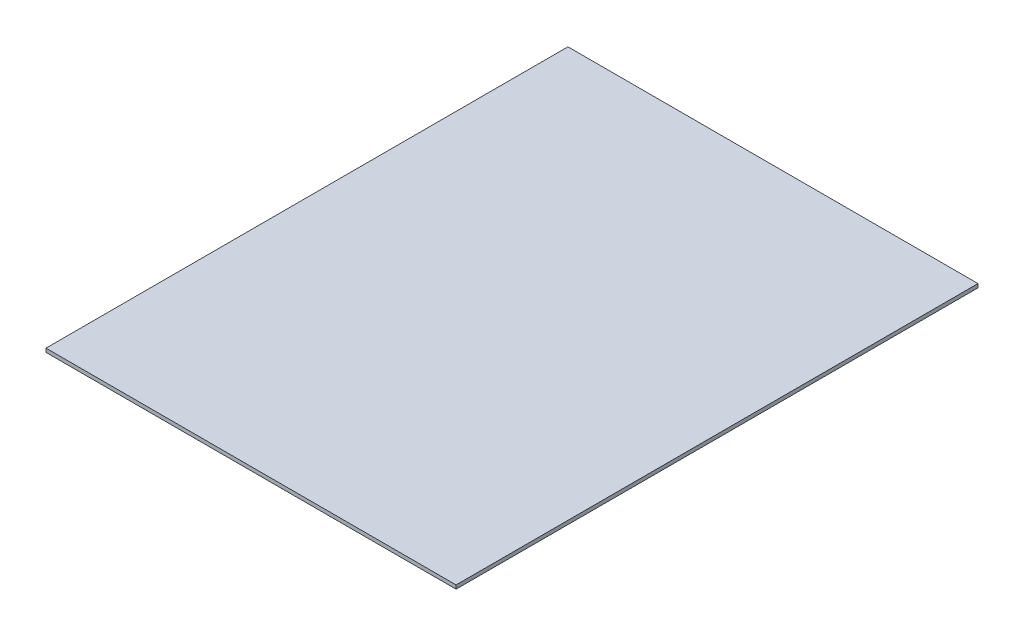
ISO-10303-21;
HEADER;
FILE_DESCRIPTION(('STEP AP214'),'2;1');
FILE_NAME('part.step','',(''),(''),'','','');
FILE_SCHEMA(('AUTOMOTIVE_DESIGN { 1 0 10303 214 1 1 1 1 }'));
ENDSEC;
DATA;
#1=APPLICATION_CONTEXT('core data for automotive mechanical design processes');
#2=APPLICATION_PROTOCOL_DEFINITION('international standard','automotive_design',2000,#1);
#3=PRODUCT_CONTEXT('',#1,'mechanical');
#4=PRODUCT('Part','Part','',(#3));
#5=PRODUCT_RELATED_PRODUCT_CATEGORY('part','',(#4));
#6=PRODUCT_DEFINITION_FORMATION('','',#4);
#7=PRODUCT_DEFINITION_CONTEXT('part definition',#1,'design');
#8=PRODUCT_DEFINITION('design','',#6,#7);
#9=PRODUCT_DEFINITION_SHAPE('','',#8);
#10=(LENGTH_UNIT() NAMED_UNIT(*) SI_UNIT(.MILLI.,.METRE.));
#11=(NAMED_UNIT(*) PLANE_ANGLE_UNIT() SI_UNIT($,.RADIAN.));
#12=(NAMED_UNIT(*) SI_UNIT($,.STERADIAN.) SOLID_ANGLE_UNIT());
#13=UNCERTAINTY_MEASURE_WITH_UNIT(LENGTH_MEASURE(1.E-05),#10,'distance_accuracy_value','');
#14=(GEOMETRIC_REPRESENTATION_CONTEXT(3) GLOBAL_UNCERTAINTY_ASSIGNED_CONTEXT((#13)) GLOBAL_UNIT_ASSIGNED_CONTEXT((#10,
#11,#12)) REPRESENTATION_CONTEXT('',''));
#15=CARTESIAN_POINT('',(0.,0.,0.));
#16=DIRECTION('',(0.,0.,1.));
#17=DIRECTION('',(1.,0.,0.));
#18=AXIS2_PLACEMENT_3D('',#15,#16,#17);
#19=CARTESIAN_POINT('',(0.,5.,0.));
#20=DIRECTION('',(-1.,0.,0.));
#21=DIRECTION('',(0.,0.,1.));
#22=AXIS2_PLACEMENT_3D('',#19,#20,#21);
#23=PLANE('',#22);
#24=DIRECTION('',(0.,0.,-1.));
#25=VECTOR('',#24,1.);
#26=CARTESIAN_POINT('',(0.,0.,0.));
#27=LINE('',#26,#25);
#28=CARTESIAN_POINT('',(0.,0.,700.));
#29=VERTEX_POINT('',#28);
#30=CARTESIAN_POINT('',(0.,0.,0.));
#31=VERTEX_POINT('',#30);
#32=EDGE_CURVE('E98',#29,#31,#27,.T.);
#33=ORIENTED_EDGE('',*,*,#32,.T.);
#34=DIRECTION('',(0.,-1.,0.));
#35=VECTOR('',#34,1.);
#36=CARTESIAN_POINT('',(0.,5.,0.));
#37=LINE('',#36,#35);
#38=CARTESIAN_POINT('',(0.,5.,0.));
#39=VERTEX_POINT('',#38);
#40=EDGE_CURVE('E11',#39,#31,#37,.T.);
#41=ORIENTED_EDGE('',*,*,#40,.F.);
#42=DIRECTION('',(0.,0.,-1.));
#43=VECTOR('',#42,1.);
#44=CARTESIAN_POINT('',(0.,5.,0.));
#45=LINE('',#44,#43);
#46=CARTESIAN_POINT('',(0.,5.,700.));
#47=VERTEX_POINT('',#46);
#48=EDGE_CURVE('E86',#47,#39,#45,.T.);
#49=ORIENTED_EDGE('',*,*,#48,.F.);
#50=DIRECTION('',(0.,-1.,0.));
#51=VECTOR('',#50,1.);
#52=CARTESIAN_POINT('',(0.,5.,700.));
#53=LINE('',#52,#51);
#54=EDGE_CURVE('E94',#47,#29,#53,.T.);
#55=ORIENTED_EDGE('',*,*,#54,.T.);
#56=EDGE_LOOP('',(#33,#41,#49,#55));
#57=FACE_BOUND('',#56,.T.);
#58=ADVANCED_FACE('F35',(#57),#23,.F.);
#59=CARTESIAN_POINT('',(0.,5.,0.));
#60=DIRECTION('',(0.,0.,1.));
#61=DIRECTION('',(1.,0.,0.));
#62=AXIS2_PLACEMENT_3D('',#59,#60,#61);
#63=PLANE('',#62);
#64=DIRECTION('',(-1.,0.,0.));
#65=VECTOR('',#64,1.);
#66=CARTESIAN_POINT('',(0.,0.,0.));
#67=LINE('',#66,#65);
#68=CARTESIAN_POINT('',(-550.,0.,0.));
#69=VERTEX_POINT('',#68);
#70=EDGE_CURVE('E90',#31,#69,#67,.T.);
#71=ORIENTED_EDGE('',*,*,#70,.T.);
#72=DIRECTION('',(0.,-1.,0.));
#73=VECTOR('',#72,1.);
#74=CARTESIAN_POINT('',(-550.,5.,0.));
#75=LINE('',#74,#73);
#76=CARTESIAN_POINT('',(-550.,5.,0.));
#77=VERTEX_POINT('',#76);
#78=EDGE_CURVE('E43',#77,#69,#75,.T.);
#79=ORIENTED_EDGE('',*,*,#78,.F.);
#80=DIRECTION('',(-1.,0.,0.));
#81=VECTOR('',#80,1.);
#82=CARTESIAN_POINT('',(0.,5.,0.));
#83=LINE('',#82,#81);
#84=EDGE_CURVE('E81',#39,#77,#83,.T.);
#85=ORIENTED_EDGE('',*,*,#84,.F.);
#86=ORIENTED_EDGE('',*,*,#40,.T.);
#87=EDGE_LOOP('',(#71,#79,#85,#86));
#88=FACE_BOUND('',#87,.T.);
#89=ADVANCED_FACE('F89',(#88),#63,.F.);
#90=CARTESIAN_POINT('',(-550.,5.,0.));
#91=DIRECTION('',(1.,0.,0.));
#92=DIRECTION('',(0.,0.,-1.));
#93=AXIS2_PLACEMENT_3D('',#90,#91,#92);
#94=PLANE('',#93);
#95=DIRECTION('',(0.,0.,1.));
#96=VECTOR('',#95,1.);
#97=CARTESIAN_POINT('',(-550.,0.,0.));
#98=LINE('',#97,#96);
#99=CARTESIAN_POINT('',(-550.,0.,700.));
#100=VERTEX_POINT('',#99);
#101=EDGE_CURVE('E68',#69,#100,#98,.T.);
#102=ORIENTED_EDGE('',*,*,#101,.T.);
#103=DIRECTION('',(0.,-1.,0.));
#104=VECTOR('',#103,1.);
#105=CARTESIAN_POINT('',(-550.,5.,700.));
#106=LINE('',#105,#104);
#107=CARTESIAN_POINT('',(-550.,5.,700.));
#108=VERTEX_POINT('',#107);
#109=EDGE_CURVE('E91',#108,#100,#106,.T.);
#110=ORIENTED_EDGE('',*,*,#109,.F.);
#111=DIRECTION('',(0.,0.,1.));
#112=VECTOR('',#111,1.);
#113=CARTESIAN_POINT('',(-550.,5.,0.));
#114=LINE('',#113,#112);
#115=EDGE_CURVE('E84',#77,#108,#114,.T.);
#116=ORIENTED_EDGE('',*,*,#115,.F.);
#117=ORIENTED_EDGE('',*,*,#78,.T.);
#118=EDGE_LOOP('',(#102,#110,#116,#117));
#119=FACE_BOUND('',#118,.T.);
#120=ADVANCED_FACE('F92',(#119),#94,.F.);
#121=CARTESIAN_POINT('',(0.,5.,700.));
#122=DIRECTION('',(0.,0.,-1.));
#123=DIRECTION('',(-1.,0.,0.));
#124=AXIS2_PLACEMENT_3D('',#121,#122,#123);
#125=PLANE('',#124);
#126=DIRECTION('',(1.,0.,0.));
#127=VECTOR('',#126,1.);
#128=CARTESIAN_POINT('',(0.,0.,700.));
#129=LINE('',#128,#127);
#130=EDGE_CURVE('E74',#100,#29,#129,.T.);
#131=ORIENTED_EDGE('',*,*,#130,.T.);
#132=ORIENTED_EDGE('',*,*,#54,.F.);
#133=DIRECTION('',(1.,0.,0.));
#134=VECTOR('',#133,1.);
#135=CARTESIAN_POINT('',(0.,5.,700.));
#136=LINE('',#135,#134);
#137=EDGE_CURVE('E51',#108,#47,#136,.T.);
#138=ORIENTED_EDGE('',*,*,#137,.F.);
#139=ORIENTED_EDGE('',*,*,#109,.T.);
#140=EDGE_LOOP('',(#131,#132,#138,#139));
#141=FACE_BOUND('',#140,.T.);
#142=ADVANCED_FACE('F105',(#141),#125,.F.);
#143=CARTESIAN_POINT('',(0.,5.,0.));
#144=DIRECTION('',(0.,-1.,0.));
#145=DIRECTION('',(0.,0.,-1.));
#146=AXIS2_PLACEMENT_3D('',#143,#144,#145);
#147=PLANE('',#146);
#148=ORIENTED_EDGE('',*,*,#48,.T.);
#149=ORIENTED_EDGE('',*,*,#84,.T.);
#150=ORIENTED_EDGE('',*,*,#115,.T.);
#151=ORIENTED_EDGE('',*,*,#137,.T.);
#152=EDGE_LOOP('',(#148,#149,#150,#151));
#153=FACE_BOUND('',#152,.T.);
#154=ADVANCED_FACE('F82',(#153),#147,.F.);
#155=CARTESIAN_POINT('',(0.,0.,0.));
#156=DIRECTION('',(0.,-1.,0.));
#157=DIRECTION('',(0.,0.,-1.));
#158=AXIS2_PLACEMENT_3D('',#155,#156,#157);
#159=PLANE('',#158);
#160=ORIENTED_EDGE('',*,*,#32,.F.);
#161=ORIENTED_EDGE('',*,*,#130,.F.);
#162=ORIENTED_EDGE('',*,*,#101,.F.);
#163=ORIENTED_EDGE('',*,*,#70,.F.);
#164=EDGE_LOOP('',(#160,#161,#162,#163));
#165=FACE_BOUND('',#164,.T.);
#166=ADVANCED_FACE('F108',(#165),#159,.T.);
#167=CLOSED_SHELL('',(#58,#89,#120,#142,#154,#166));
#168=MANIFOLD_SOLID_BREP('B2',#167);
#169=ADVANCED_BREP_SHAPE_REPRESENTATION('',(#18,#168),#14);
#170=SHAPE_DEFINITION_REPRESENTATION(#9,#169);
ENDSEC;
END-ISO-10303-21;
